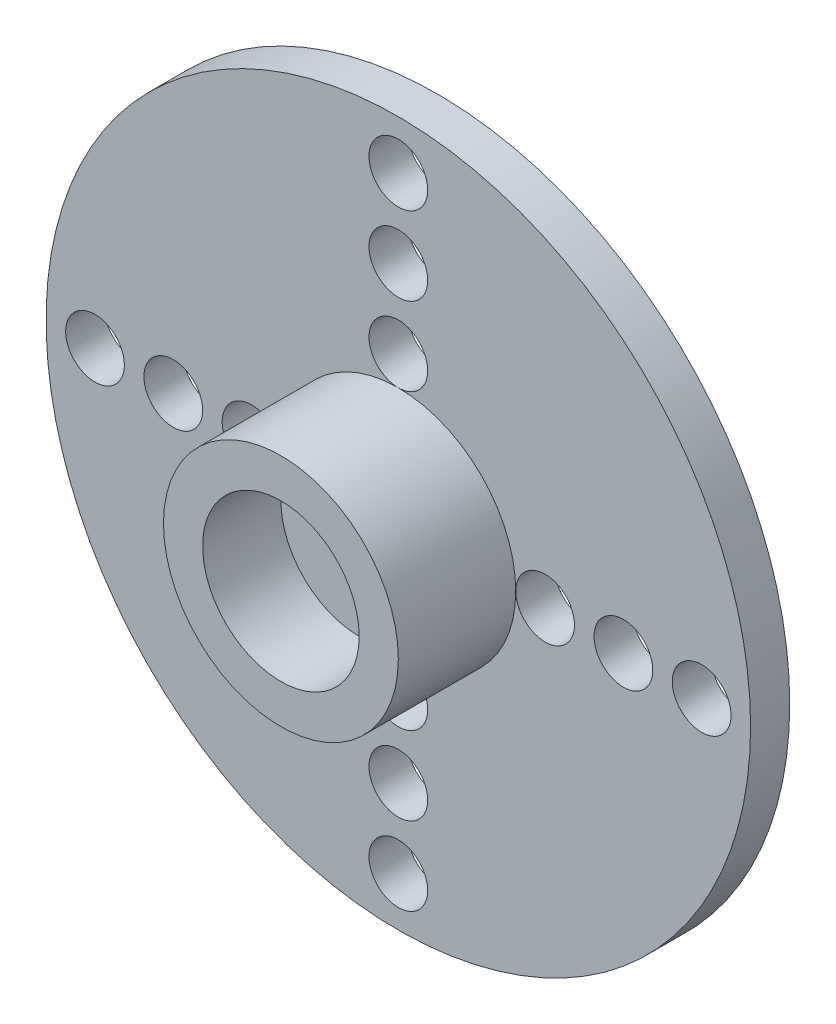
ISO-10303-21;
HEADER;
FILE_DESCRIPTION(('STEP AP214'),'2;1');
FILE_NAME('part.step','',(''),(''),'','','');
FILE_SCHEMA(('AUTOMOTIVE_DESIGN { 1 0 10303 214 1 1 1 1 }'));
ENDSEC;
DATA;
#1=APPLICATION_CONTEXT('core data for automotive mechanical design processes');
#2=APPLICATION_PROTOCOL_DEFINITION('international standard','automotive_design',2000,#1);
#3=PRODUCT_CONTEXT('',#1,'mechanical');
#4=PRODUCT('Part','Part','',(#3));
#5=PRODUCT_RELATED_PRODUCT_CATEGORY('part','',(#4));
#6=PRODUCT_DEFINITION_FORMATION('','',#4);
#7=PRODUCT_DEFINITION_CONTEXT('part definition',#1,'design');
#8=PRODUCT_DEFINITION('design','',#6,#7);
#9=PRODUCT_DEFINITION_SHAPE('','',#8);
#10=(LENGTH_UNIT() NAMED_UNIT(*) SI_UNIT(.MILLI.,.METRE.));
#11=(NAMED_UNIT(*) PLANE_ANGLE_UNIT() SI_UNIT($,.RADIAN.));
#12=(NAMED_UNIT(*) SI_UNIT($,.STERADIAN.) SOLID_ANGLE_UNIT());
#13=UNCERTAINTY_MEASURE_WITH_UNIT(LENGTH_MEASURE(1.E-05),#10,'distance_accuracy_value','');
#14=(GEOMETRIC_REPRESENTATION_CONTEXT(3) GLOBAL_UNCERTAINTY_ASSIGNED_CONTEXT((#13)) GLOBAL_UNIT_ASSIGNED_CONTEXT((#10,
#11,#12)) REPRESENTATION_CONTEXT('',''));
#15=CARTESIAN_POINT('',(0.,0.,0.));
#16=DIRECTION('',(0.,0.,1.));
#17=DIRECTION('',(1.,0.,0.));
#18=AXIS2_PLACEMENT_3D('',#15,#16,#17);
#19=CARTESIAN_POINT('',(0.,0.,1.));
#20=DIRECTION('',(0.,0.,-1.));
#21=DIRECTION('',(-1.,0.,0.));
#22=AXIS2_PLACEMENT_3D('',#19,#20,#21);
#23=CYLINDRICAL_SURFACE('',#22,9.);
#24=CARTESIAN_POINT('',(0.,0.,1.));
#25=DIRECTION('',(0.,0.,1.));
#26=DIRECTION('',(1.,0.,0.));
#27=AXIS2_PLACEMENT_3D('',#24,#25,#26);
#28=CIRCLE('',#27,9.);
#29=CARTESIAN_POINT('',(9.,0.,1.));
#30=VERTEX_POINT('',#29);
#31=EDGE_CURVE('E44',#30,#30,#28,.T.);
#32=ORIENTED_EDGE('',*,*,#31,.F.);
#33=EDGE_LOOP('',(#32));
#34=FACE_BOUND('',#33,.T.);
#35=CARTESIAN_POINT('',(0.,0.,0.));
#36=DIRECTION('',(0.,0.,1.));
#37=DIRECTION('',(1.,0.,0.));
#38=AXIS2_PLACEMENT_3D('',#35,#36,#37);
#39=CIRCLE('',#38,9.);
#40=CARTESIAN_POINT('',(9.,0.,0.));
#41=VERTEX_POINT('',#40);
#42=EDGE_CURVE('E90',#41,#41,#39,.T.);
#43=ORIENTED_EDGE('',*,*,#42,.T.);
#44=EDGE_LOOP('',(#43));
#45=FACE_BOUND('',#44,.T.);
#46=ADVANCED_FACE('F37',(#34,#45),#23,.T.);
#47=CARTESIAN_POINT('',(0.,0.,1.));
#48=DIRECTION('',(0.,0.,1.));
#49=DIRECTION('',(1.,0.,0.));
#50=AXIS2_PLACEMENT_3D('',#47,#48,#49);
#51=PLANE('',#50);
#52=CARTESIAN_POINT('',(0.,-7.75,1.));
#53=DIRECTION('',(0.,0.,1.));
#54=DIRECTION('',(-1.,0.,0.));
#55=AXIS2_PLACEMENT_3D('',#52,#53,#54);
#56=CIRCLE('',#55,0.75);
#57=CARTESIAN_POINT('',(-0.75,-7.75,1.));
#58=VERTEX_POINT('',#57);
#59=EDGE_CURVE('E139',#58,#58,#56,.T.);
#60=ORIENTED_EDGE('',*,*,#59,.F.);
#61=EDGE_LOOP('',(#60));
#62=FACE_BOUND('',#61,.T.);
#63=CARTESIAN_POINT('',(0.,-5.75,1.));
#64=DIRECTION('',(0.,0.,1.));
#65=DIRECTION('',(-1.,0.,0.));
#66=AXIS2_PLACEMENT_3D('',#63,#64,#65);
#67=CIRCLE('',#66,0.75);
#68=CARTESIAN_POINT('',(-0.75,-5.75,1.));
#69=VERTEX_POINT('',#68);
#70=EDGE_CURVE('E134',#69,#69,#67,.T.);
#71=ORIENTED_EDGE('',*,*,#70,.F.);
#72=EDGE_LOOP('',(#71));
#73=FACE_BOUND('',#72,.T.);
#74=CARTESIAN_POINT('',(5.75,0.,1.));
#75=DIRECTION('',(0.,0.,1.));
#76=DIRECTION('',(1.,0.,0.));
#77=AXIS2_PLACEMENT_3D('',#74,#75,#76);
#78=CIRCLE('',#77,0.75);
#79=CARTESIAN_POINT('',(6.5,0.,1.));
#80=VERTEX_POINT('',#79);
#81=EDGE_CURVE('E75',#80,#80,#78,.T.);
#82=ORIENTED_EDGE('',*,*,#81,.F.);
#83=EDGE_LOOP('',(#82));
#84=FACE_BOUND('',#83,.T.);
#85=CARTESIAN_POINT('',(7.75,0.,1.));
#86=DIRECTION('',(0.,0.,1.));
#87=DIRECTION('',(1.,0.,0.));
#88=AXIS2_PLACEMENT_3D('',#85,#86,#87);
#89=CIRCLE('',#88,0.75);
#90=CARTESIAN_POINT('',(8.5,0.,1.));
#91=VERTEX_POINT('',#90);
#92=EDGE_CURVE('E116',#91,#91,#89,.T.);
#93=ORIENTED_EDGE('',*,*,#92,.F.);
#94=EDGE_LOOP('',(#93));
#95=FACE_BOUND('',#94,.T.);
#96=CARTESIAN_POINT('',(-5.75,0.,1.));
#97=DIRECTION('',(0.,0.,1.));
#98=DIRECTION('',(-1.,0.,0.));
#99=AXIS2_PLACEMENT_3D('',#96,#97,#98);
#100=CIRCLE('',#99,0.75);
#101=CARTESIAN_POINT('',(-6.5,0.,1.));
#102=VERTEX_POINT('',#101);
#103=EDGE_CURVE('E119',#102,#102,#100,.T.);
#104=ORIENTED_EDGE('',*,*,#103,.F.);
#105=EDGE_LOOP('',(#104));
#106=FACE_BOUND('',#105,.T.);
#107=CARTESIAN_POINT('',(-7.75,0.,1.));
#108=DIRECTION('',(0.,0.,1.));
#109=DIRECTION('',(-1.,0.,0.));
#110=AXIS2_PLACEMENT_3D('',#107,#108,#109);
#111=CIRCLE('',#110,0.75);
#112=CARTESIAN_POINT('',(-8.5,0.,1.));
#113=VERTEX_POINT('',#112);
#114=EDGE_CURVE('E162',#113,#113,#111,.T.);
#115=ORIENTED_EDGE('',*,*,#114,.F.);
#116=EDGE_LOOP('',(#115));
#117=FACE_BOUND('',#116,.T.);
#118=CARTESIAN_POINT('',(0.,5.75,1.));
#119=DIRECTION('',(0.,0.,1.));
#120=DIRECTION('',(1.,0.,0.));
#121=AXIS2_PLACEMENT_3D('',#118,#119,#120);
#122=CIRCLE('',#121,0.75);
#123=CARTESIAN_POINT('',(0.75,5.75,1.));
#124=VERTEX_POINT('',#123);
#125=EDGE_CURVE('E166',#124,#124,#122,.T.);
#126=ORIENTED_EDGE('',*,*,#125,.F.);
#127=EDGE_LOOP('',(#126));
#128=FACE_BOUND('',#127,.T.);
#129=CARTESIAN_POINT('',(0.,7.75,1.));
#130=DIRECTION('',(0.,0.,1.));
#131=DIRECTION('',(1.,0.,0.));
#132=AXIS2_PLACEMENT_3D('',#129,#130,#131);
#133=CIRCLE('',#132,0.75);
#134=CARTESIAN_POINT('',(0.75,7.75,1.));
#135=VERTEX_POINT('',#134);
#136=EDGE_CURVE('E129',#135,#135,#133,.T.);
#137=ORIENTED_EDGE('',*,*,#136,.F.);
#138=EDGE_LOOP('',(#137));
#139=FACE_BOUND('',#138,.T.);
#140=CARTESIAN_POINT('',(0.,0.,1.));
#141=DIRECTION('',(0.,0.,1.));
#142=DIRECTION('',(1.,0.,0.));
#143=AXIS2_PLACEMENT_3D('',#140,#141,#142);
#144=CIRCLE('',#143,3.);
#145=CARTESIAN_POINT('',(0.,-3.,1.));
#146=VERTEX_POINT('',#145);
#147=CARTESIAN_POINT('',(3.,0.,1.));
#148=VERTEX_POINT('',#147);
#149=EDGE_CURVE('E95',#146,#148,#144,.T.);
#150=ORIENTED_EDGE('',*,*,#149,.F.);
#151=CARTESIAN_POINT('',(0.,-3.75,1.));
#152=DIRECTION('',(0.,0.,1.));
#153=DIRECTION('',(-1.,0.,0.));
#154=AXIS2_PLACEMENT_3D('',#151,#152,#153);
#155=CIRCLE('',#154,0.75);
#156=EDGE_CURVE('E49',#146,#146,#155,.T.);
#157=ORIENTED_EDGE('',*,*,#156,.F.);
#158=CARTESIAN_POINT('',(-3.,0.,1.));
#159=VERTEX_POINT('',#158);
#160=EDGE_CURVE('E100',#159,#146,#144,.T.);
#161=ORIENTED_EDGE('',*,*,#160,.F.);
#162=CARTESIAN_POINT('',(-3.75,0.,1.));
#163=DIRECTION('',(0.,0.,1.));
#164=DIRECTION('',(-1.,0.,0.));
#165=AXIS2_PLACEMENT_3D('',#162,#163,#164);
#166=CIRCLE('',#165,0.75);
#167=EDGE_CURVE('E54',#159,#159,#166,.T.);
#168=ORIENTED_EDGE('',*,*,#167,.F.);
#169=CARTESIAN_POINT('',(0.,3.,1.));
#170=VERTEX_POINT('',#169);
#171=EDGE_CURVE('E94',#170,#159,#144,.T.);
#172=ORIENTED_EDGE('',*,*,#171,.F.);
#173=CARTESIAN_POINT('',(0.,3.75,1.));
#174=DIRECTION('',(0.,0.,1.));
#175=DIRECTION('',(1.,0.,0.));
#176=AXIS2_PLACEMENT_3D('',#173,#174,#175);
#177=CIRCLE('',#176,0.75);
#178=EDGE_CURVE('E111',#170,#170,#177,.T.);
#179=ORIENTED_EDGE('',*,*,#178,.F.);
#180=EDGE_CURVE('E91',#148,#170,#144,.T.);
#181=ORIENTED_EDGE('',*,*,#180,.F.);
#182=CARTESIAN_POINT('',(3.75,0.,1.));
#183=DIRECTION('',(0.,0.,1.));
#184=DIRECTION('',(1.,0.,0.));
#185=AXIS2_PLACEMENT_3D('',#182,#183,#184);
#186=CIRCLE('',#185,0.75);
#187=EDGE_CURVE('E62',#148,#148,#186,.T.);
#188=ORIENTED_EDGE('',*,*,#187,.F.);
#189=EDGE_LOOP('',(#150,#157,#161,#168,#172,#179,#181,#188));
#190=FACE_BOUND('',#189,.T.);
#191=ORIENTED_EDGE('',*,*,#31,.T.);
#192=EDGE_LOOP('',(#191));
#193=FACE_BOUND('',#192,.T.);
#194=ADVANCED_FACE('F109',(#62,#73,#84,#95,#106,#117,#128,#139,#190,#193),#51,.T.);
#195=CARTESIAN_POINT('',(0.,0.,0.));
#196=DIRECTION('',(0.,0.,1.));
#197=DIRECTION('',(1.,0.,0.));
#198=AXIS2_PLACEMENT_3D('',#195,#196,#197);
#199=PLANE('',#198);
#200=CARTESIAN_POINT('',(0.,-7.75,0.));
#201=DIRECTION('',(0.,0.,1.));
#202=DIRECTION('',(-1.,0.,0.));
#203=AXIS2_PLACEMENT_3D('',#200,#201,#202);
#204=CIRCLE('',#203,0.75);
#205=CARTESIAN_POINT('',(-0.75,-7.75,0.));
#206=VERTEX_POINT('',#205);
#207=EDGE_CURVE('E137',#206,#206,#204,.T.);
#208=ORIENTED_EDGE('',*,*,#207,.T.);
#209=EDGE_LOOP('',(#208));
#210=FACE_BOUND('',#209,.T.);
#211=CARTESIAN_POINT('',(0.,-5.75,0.));
#212=DIRECTION('',(0.,0.,1.));
#213=DIRECTION('',(-1.,0.,0.));
#214=AXIS2_PLACEMENT_3D('',#211,#212,#213);
#215=CIRCLE('',#214,0.75);
#216=CARTESIAN_POINT('',(-0.75,-5.75,0.));
#217=VERTEX_POINT('',#216);
#218=EDGE_CURVE('E131',#217,#217,#215,.T.);
#219=ORIENTED_EDGE('',*,*,#218,.T.);
#220=EDGE_LOOP('',(#219));
#221=FACE_BOUND('',#220,.T.);
#222=CARTESIAN_POINT('',(0.,-3.75,0.));
#223=DIRECTION('',(0.,0.,1.));
#224=DIRECTION('',(-1.,0.,0.));
#225=AXIS2_PLACEMENT_3D('',#222,#223,#224);
#226=CIRCLE('',#225,0.75);
#227=CARTESIAN_POINT('',(-0.75,-3.75,0.));
#228=VERTEX_POINT('',#227);
#229=EDGE_CURVE('E126',#228,#228,#226,.T.);
#230=ORIENTED_EDGE('',*,*,#229,.T.);
#231=EDGE_LOOP('',(#230));
#232=FACE_BOUND('',#231,.T.);
#233=CARTESIAN_POINT('',(5.75,0.,0.));
#234=DIRECTION('',(0.,0.,1.));
#235=DIRECTION('',(1.,0.,0.));
#236=AXIS2_PLACEMENT_3D('',#233,#234,#235);
#237=CIRCLE('',#236,0.75);
#238=CARTESIAN_POINT('',(6.5,0.,0.));
#239=VERTEX_POINT('',#238);
#240=EDGE_CURVE('E69',#239,#239,#237,.T.);
#241=ORIENTED_EDGE('',*,*,#240,.T.);
#242=EDGE_LOOP('',(#241));
#243=FACE_BOUND('',#242,.T.);
#244=CARTESIAN_POINT('',(7.75,0.,0.));
#245=DIRECTION('',(0.,0.,1.));
#246=DIRECTION('',(1.,0.,0.));
#247=AXIS2_PLACEMENT_3D('',#244,#245,#246);
#248=CIRCLE('',#247,0.75);
#249=CARTESIAN_POINT('',(8.5,0.,0.));
#250=VERTEX_POINT('',#249);
#251=EDGE_CURVE('E177',#250,#250,#248,.T.);
#252=ORIENTED_EDGE('',*,*,#251,.T.);
#253=EDGE_LOOP('',(#252));
#254=FACE_BOUND('',#253,.T.);
#255=CARTESIAN_POINT('',(-3.75,0.,0.));
#256=DIRECTION('',(0.,0.,1.));
#257=DIRECTION('',(-1.,0.,0.));
#258=AXIS2_PLACEMENT_3D('',#255,#256,#257);
#259=CIRCLE('',#258,0.75);
#260=CARTESIAN_POINT('',(-4.5,0.,0.));
#261=VERTEX_POINT('',#260);
#262=EDGE_CURVE('E112',#261,#261,#259,.T.);
#263=ORIENTED_EDGE('',*,*,#262,.T.);
#264=EDGE_LOOP('',(#263));
#265=FACE_BOUND('',#264,.T.);
#266=CARTESIAN_POINT('',(-5.75,0.,0.));
#267=DIRECTION('',(0.,0.,1.));
#268=DIRECTION('',(-1.,0.,0.));
#269=AXIS2_PLACEMENT_3D('',#266,#267,#268);
#270=CIRCLE('',#269,0.75);
#271=CARTESIAN_POINT('',(-6.5,0.,0.));
#272=VERTEX_POINT('',#271);
#273=EDGE_CURVE('E113',#272,#272,#270,.T.);
#274=ORIENTED_EDGE('',*,*,#273,.T.);
#275=EDGE_LOOP('',(#274));
#276=FACE_BOUND('',#275,.T.);
#277=CARTESIAN_POINT('',(-7.75,0.,0.));
#278=DIRECTION('',(0.,0.,1.));
#279=DIRECTION('',(-1.,0.,0.));
#280=AXIS2_PLACEMENT_3D('',#277,#278,#279);
#281=CIRCLE('',#280,0.75);
#282=CARTESIAN_POINT('',(-8.5,0.,0.));
#283=VERTEX_POINT('',#282);
#284=EDGE_CURVE('E125',#283,#283,#281,.T.);
#285=ORIENTED_EDGE('',*,*,#284,.T.);
#286=EDGE_LOOP('',(#285));
#287=FACE_BOUND('',#286,.T.);
#288=CARTESIAN_POINT('',(0.,3.75,0.));
#289=DIRECTION('',(0.,0.,1.));
#290=DIRECTION('',(1.,0.,0.));
#291=AXIS2_PLACEMENT_3D('',#288,#289,#290);
#292=CIRCLE('',#291,0.75);
#293=CARTESIAN_POINT('',(0.75,3.75,0.));
#294=VERTEX_POINT('',#293);
#295=EDGE_CURVE('E361',#294,#294,#292,.T.);
#296=ORIENTED_EDGE('',*,*,#295,.T.);
#297=EDGE_LOOP('',(#296));
#298=FACE_BOUND('',#297,.T.);
#299=CARTESIAN_POINT('',(0.,5.75,0.));
#300=DIRECTION('',(0.,0.,1.));
#301=DIRECTION('',(1.,0.,0.));
#302=AXIS2_PLACEMENT_3D('',#299,#300,#301);
#303=CIRCLE('',#302,0.75);
#304=CARTESIAN_POINT('',(0.75,5.75,0.));
#305=VERTEX_POINT('',#304);
#306=EDGE_CURVE('E365',#305,#305,#303,.T.);
#307=ORIENTED_EDGE('',*,*,#306,.T.);
#308=EDGE_LOOP('',(#307));
#309=FACE_BOUND('',#308,.T.);
#310=CARTESIAN_POINT('',(0.,7.75,0.));
#311=DIRECTION('',(0.,0.,1.));
#312=DIRECTION('',(1.,0.,0.));
#313=AXIS2_PLACEMENT_3D('',#310,#311,#312);
#314=CIRCLE('',#313,0.75);
#315=CARTESIAN_POINT('',(0.75,7.75,0.));
#316=VERTEX_POINT('',#315);
#317=EDGE_CURVE('E170',#316,#316,#314,.T.);
#318=ORIENTED_EDGE('',*,*,#317,.T.);
#319=EDGE_LOOP('',(#318));
#320=FACE_BOUND('',#319,.T.);
#321=CARTESIAN_POINT('',(3.75,0.,0.));
#322=DIRECTION('',(0.,0.,1.));
#323=DIRECTION('',(1.,0.,0.));
#324=AXIS2_PLACEMENT_3D('',#321,#322,#323);
#325=CIRCLE('',#324,0.75);
#326=CARTESIAN_POINT('',(4.5,0.,0.));
#327=VERTEX_POINT('',#326);
#328=EDGE_CURVE('E68',#327,#327,#325,.T.);
#329=ORIENTED_EDGE('',*,*,#328,.T.);
#330=EDGE_LOOP('',(#329));
#331=FACE_BOUND('',#330,.T.);
#332=CARTESIAN_POINT('',(0.,0.,0.));
#333=DIRECTION('',(0.,0.,1.));
#334=DIRECTION('',(1.,0.,0.));
#335=AXIS2_PLACEMENT_3D('',#332,#333,#334);
#336=CIRCLE('',#335,0.75);
#337=CARTESIAN_POINT('',(0.75,0.,0.));
#338=VERTEX_POINT('',#337);
#339=EDGE_CURVE('E79',#338,#338,#336,.T.);
#340=ORIENTED_EDGE('',*,*,#339,.T.);
#341=EDGE_LOOP('',(#340));
#342=FACE_BOUND('',#341,.T.);
#343=ORIENTED_EDGE('',*,*,#42,.F.);
#344=EDGE_LOOP('',(#343));
#345=FACE_BOUND('',#344,.T.);
#346=ADVANCED_FACE('F147',(#210,#221,#232,#243,#254,#265,#276,#287,#298,#309,#320,#331,#342,
#345),#199,.F.);
#347=CARTESIAN_POINT('',(0.,0.,4.));
#348=DIRECTION('',(0.,0.,-1.));
#349=DIRECTION('',(-1.,0.,0.));
#350=AXIS2_PLACEMENT_3D('',#347,#348,#349);
#351=CYLINDRICAL_SURFACE('',#350,2.);
#352=CARTESIAN_POINT('',(0.,0.,2.));
#353=DIRECTION('',(0.,0.,1.));
#354=DIRECTION('',(1.,0.,0.));
#355=AXIS2_PLACEMENT_3D('',#352,#353,#354);
#356=CIRCLE('',#355,2.);
#357=CARTESIAN_POINT('',(2.,0.,2.));
#358=VERTEX_POINT('',#357);
#359=EDGE_CURVE('E11',#358,#358,#356,.T.);
#360=ORIENTED_EDGE('',*,*,#359,.F.);
#361=EDGE_LOOP('',(#360));
#362=FACE_BOUND('',#361,.T.);
#363=CARTESIAN_POINT('',(0.,0.,4.));
#364=DIRECTION('',(0.,0.,1.));
#365=DIRECTION('',(1.,0.,0.));
#366=AXIS2_PLACEMENT_3D('',#363,#364,#365);
#367=CIRCLE('',#366,2.);
#368=CARTESIAN_POINT('',(2.,0.,4.));
#369=VERTEX_POINT('',#368);
#370=EDGE_CURVE('E82',#369,#369,#367,.T.);
#371=ORIENTED_EDGE('',*,*,#370,.T.);
#372=EDGE_LOOP('',(#371));
#373=FACE_BOUND('',#372,.T.);
#374=ADVANCED_FACE('F214',(#362,#373),#351,.F.);
#375=CARTESIAN_POINT('',(0.,0.,4.));
#376=DIRECTION('',(0.,0.,-1.));
#377=DIRECTION('',(-1.,0.,0.));
#378=AXIS2_PLACEMENT_3D('',#375,#376,#377);
#379=CYLINDRICAL_SURFACE('',#378,3.);
#380=ORIENTED_EDGE('',*,*,#180,.T.);
#381=ORIENTED_EDGE('',*,*,#171,.T.);
#382=ORIENTED_EDGE('',*,*,#160,.T.);
#383=ORIENTED_EDGE('',*,*,#149,.T.);
#384=EDGE_LOOP('',(#380,#381,#382,#383));
#385=FACE_BOUND('',#384,.T.);
#386=CARTESIAN_POINT('',(0.,0.,4.));
#387=DIRECTION('',(0.,0.,1.));
#388=DIRECTION('',(1.,0.,0.));
#389=AXIS2_PLACEMENT_3D('',#386,#387,#388);
#390=CIRCLE('',#389,3.);
#391=CARTESIAN_POINT('',(3.,0.,4.));
#392=VERTEX_POINT('',#391);
#393=EDGE_CURVE('E87',#392,#392,#390,.T.);
#394=ORIENTED_EDGE('',*,*,#393,.F.);
#395=EDGE_LOOP('',(#394));
#396=FACE_BOUND('',#395,.T.);
#397=ADVANCED_FACE('F106',(#385,#396),#379,.T.);
#398=CARTESIAN_POINT('',(0.,0.,4.));
#399=DIRECTION('',(0.,0.,1.));
#400=DIRECTION('',(1.,0.,0.));
#401=AXIS2_PLACEMENT_3D('',#398,#399,#400);
#402=PLANE('',#401);
#403=ORIENTED_EDGE('',*,*,#370,.F.);
#404=EDGE_LOOP('',(#403));
#405=FACE_BOUND('',#404,.T.);
#406=ORIENTED_EDGE('',*,*,#393,.T.);
#407=EDGE_LOOP('',(#406));
#408=FACE_BOUND('',#407,.T.);
#409=ADVANCED_FACE('F229',(#405,#408),#402,.T.);
#410=CARTESIAN_POINT('',(0.,0.,2.));
#411=DIRECTION('',(0.,0.,1.));
#412=DIRECTION('',(1.,0.,0.));
#413=AXIS2_PLACEMENT_3D('',#410,#411,#412);
#414=PLANE('',#413);
#415=CARTESIAN_POINT('',(0.,0.,2.));
#416=DIRECTION('',(0.,0.,1.));
#417=DIRECTION('',(1.,0.,0.));
#418=AXIS2_PLACEMENT_3D('',#415,#416,#417);
#419=CIRCLE('',#418,0.75);
#420=CARTESIAN_POINT('',(0.75,0.,2.));
#421=VERTEX_POINT('',#420);
#422=EDGE_CURVE('E72',#421,#421,#419,.T.);
#423=ORIENTED_EDGE('',*,*,#422,.F.);
#424=EDGE_LOOP('',(#423));
#425=FACE_BOUND('',#424,.T.);
#426=ORIENTED_EDGE('',*,*,#359,.T.);
#427=EDGE_LOOP('',(#426));
#428=FACE_BOUND('',#427,.T.);
#429=ADVANCED_FACE('F236',(#425,#428),#414,.T.);
#430=CARTESIAN_POINT('',(0.,0.,0.));
#431=DIRECTION('',(0.,0.,1.));
#432=DIRECTION('',(1.,0.,0.));
#433=AXIS2_PLACEMENT_3D('',#430,#431,#432);
#434=CYLINDRICAL_SURFACE('',#433,0.75);
#435=ORIENTED_EDGE('',*,*,#339,.F.);
#436=EDGE_LOOP('',(#435));
#437=FACE_BOUND('',#436,.T.);
#438=ORIENTED_EDGE('',*,*,#422,.T.);
#439=EDGE_LOOP('',(#438));
#440=FACE_BOUND('',#439,.T.);
#441=ADVANCED_FACE('F243',(#437,#440),#434,.F.);
#442=CARTESIAN_POINT('',(3.75,0.,0.));
#443=DIRECTION('',(0.,0.,1.));
#444=DIRECTION('',(1.,0.,0.));
#445=AXIS2_PLACEMENT_3D('',#442,#443,#444);
#446=CYLINDRICAL_SURFACE('',#445,0.75);
#447=ORIENTED_EDGE('',*,*,#328,.F.);
#448=EDGE_LOOP('',(#447));
#449=FACE_BOUND('',#448,.T.);
#450=ORIENTED_EDGE('',*,*,#187,.T.);
#451=EDGE_LOOP('',(#450));
#452=FACE_BOUND('',#451,.T.);
#453=ADVANCED_FACE('F63',(#449,#452),#446,.F.);
#454=CARTESIAN_POINT('',(0.,7.75,0.));
#455=DIRECTION('',(0.,0.,1.));
#456=DIRECTION('',(1.,0.,0.));
#457=AXIS2_PLACEMENT_3D('',#454,#455,#456);
#458=CYLINDRICAL_SURFACE('',#457,0.75);
#459=ORIENTED_EDGE('',*,*,#317,.F.);
#460=EDGE_LOOP('',(#459));
#461=FACE_BOUND('',#460,.T.);
#462=ORIENTED_EDGE('',*,*,#136,.T.);
#463=EDGE_LOOP('',(#462));
#464=FACE_BOUND('',#463,.T.);
#465=ADVANCED_FACE('F256',(#461,#464),#458,.F.);
#466=CARTESIAN_POINT('',(0.,5.75,0.));
#467=DIRECTION('',(0.,0.,1.));
#468=DIRECTION('',(1.,0.,0.));
#469=AXIS2_PLACEMENT_3D('',#466,#467,#468);
#470=CYLINDRICAL_SURFACE('',#469,0.75);
#471=ORIENTED_EDGE('',*,*,#306,.F.);
#472=EDGE_LOOP('',(#471));
#473=FACE_BOUND('',#472,.T.);
#474=ORIENTED_EDGE('',*,*,#125,.T.);
#475=EDGE_LOOP('',(#474));
#476=FACE_BOUND('',#475,.T.);
#477=ADVANCED_FACE('F264',(#473,#476),#470,.F.);
#478=CARTESIAN_POINT('',(0.,3.75,0.));
#479=DIRECTION('',(0.,0.,1.));
#480=DIRECTION('',(1.,0.,0.));
#481=AXIS2_PLACEMENT_3D('',#478,#479,#480);
#482=CYLINDRICAL_SURFACE('',#481,0.75);
#483=ORIENTED_EDGE('',*,*,#295,.F.);
#484=EDGE_LOOP('',(#483));
#485=FACE_BOUND('',#484,.T.);
#486=ORIENTED_EDGE('',*,*,#178,.T.);
#487=EDGE_LOOP('',(#486));
#488=FACE_BOUND('',#487,.T.);
#489=ADVANCED_FACE('F272',(#485,#488),#482,.F.);
#490=CARTESIAN_POINT('',(-7.75,0.,0.));
#491=DIRECTION('',(0.,0.,1.));
#492=DIRECTION('',(1.,0.,0.));
#493=AXIS2_PLACEMENT_3D('',#490,#491,#492);
#494=CYLINDRICAL_SURFACE('',#493,0.75);
#495=ORIENTED_EDGE('',*,*,#284,.F.);
#496=EDGE_LOOP('',(#495));
#497=FACE_BOUND('',#496,.T.);
#498=ORIENTED_EDGE('',*,*,#114,.T.);
#499=EDGE_LOOP('',(#498));
#500=FACE_BOUND('',#499,.T.);
#501=ADVANCED_FACE('F280',(#497,#500),#494,.F.);
#502=CARTESIAN_POINT('',(-5.75,0.,0.));
#503=DIRECTION('',(0.,0.,1.));
#504=DIRECTION('',(1.,0.,0.));
#505=AXIS2_PLACEMENT_3D('',#502,#503,#504);
#506=CYLINDRICAL_SURFACE('',#505,0.75);
#507=ORIENTED_EDGE('',*,*,#273,.F.);
#508=EDGE_LOOP('',(#507));
#509=FACE_BOUND('',#508,.T.);
#510=ORIENTED_EDGE('',*,*,#103,.T.);
#511=EDGE_LOOP('',(#510));
#512=FACE_BOUND('',#511,.T.);
#513=ADVANCED_FACE('F193',(#509,#512),#506,.F.);
#514=CARTESIAN_POINT('',(-3.75,0.,0.));
#515=DIRECTION('',(0.,0.,1.));
#516=DIRECTION('',(1.,0.,0.));
#517=AXIS2_PLACEMENT_3D('',#514,#515,#516);
#518=CYLINDRICAL_SURFACE('',#517,0.75);
#519=ORIENTED_EDGE('',*,*,#262,.F.);
#520=EDGE_LOOP('',(#519));
#521=FACE_BOUND('',#520,.T.);
#522=ORIENTED_EDGE('',*,*,#167,.T.);
#523=EDGE_LOOP('',(#522));
#524=FACE_BOUND('',#523,.T.);
#525=ADVANCED_FACE('F183',(#521,#524),#518,.F.);
#526=CARTESIAN_POINT('',(7.75,0.,0.));
#527=DIRECTION('',(0.,0.,1.));
#528=DIRECTION('',(1.,0.,0.));
#529=AXIS2_PLACEMENT_3D('',#526,#527,#528);
#530=CYLINDRICAL_SURFACE('',#529,0.75);
#531=ORIENTED_EDGE('',*,*,#251,.F.);
#532=EDGE_LOOP('',(#531));
#533=FACE_BOUND('',#532,.T.);
#534=ORIENTED_EDGE('',*,*,#92,.T.);
#535=EDGE_LOOP('',(#534));
#536=FACE_BOUND('',#535,.T.);
#537=ADVANCED_FACE('F180',(#533,#536),#530,.F.);
#538=CARTESIAN_POINT('',(5.75,0.,0.));
#539=DIRECTION('',(0.,0.,1.));
#540=DIRECTION('',(1.,0.,0.));
#541=AXIS2_PLACEMENT_3D('',#538,#539,#540);
#542=CYLINDRICAL_SURFACE('',#541,0.75);
#543=ORIENTED_EDGE('',*,*,#240,.F.);
#544=EDGE_LOOP('',(#543));
#545=FACE_BOUND('',#544,.T.);
#546=ORIENTED_EDGE('',*,*,#81,.T.);
#547=EDGE_LOOP('',(#546));
#548=FACE_BOUND('',#547,.T.);
#549=ADVANCED_FACE('F182',(#545,#548),#542,.F.);
#550=CARTESIAN_POINT('',(0.,-3.75,0.));
#551=DIRECTION('',(0.,0.,1.));
#552=DIRECTION('',(1.,0.,0.));
#553=AXIS2_PLACEMENT_3D('',#550,#551,#552);
#554=CYLINDRICAL_SURFACE('',#553,0.75);
#555=ORIENTED_EDGE('',*,*,#229,.F.);
#556=EDGE_LOOP('',(#555));
#557=FACE_BOUND('',#556,.T.);
#558=ORIENTED_EDGE('',*,*,#156,.T.);
#559=EDGE_LOOP('',(#558));
#560=FACE_BOUND('',#559,.T.);
#561=ADVANCED_FACE('F190',(#557,#560),#554,.F.);
#562=CARTESIAN_POINT('',(0.,-5.75,0.));
#563=DIRECTION('',(0.,0.,1.));
#564=DIRECTION('',(1.,0.,0.));
#565=AXIS2_PLACEMENT_3D('',#562,#563,#564);
#566=CYLINDRICAL_SURFACE('',#565,0.75);
#567=ORIENTED_EDGE('',*,*,#218,.F.);
#568=EDGE_LOOP('',(#567));
#569=FACE_BOUND('',#568,.T.);
#570=ORIENTED_EDGE('',*,*,#70,.T.);
#571=EDGE_LOOP('',(#570));
#572=FACE_BOUND('',#571,.T.);
#573=ADVANCED_FACE('F319',(#569,#572),#566,.F.);
#574=CARTESIAN_POINT('',(0.,-7.75,0.));
#575=DIRECTION('',(0.,0.,1.));
#576=DIRECTION('',(1.,0.,0.));
#577=AXIS2_PLACEMENT_3D('',#574,#575,#576);
#578=CYLINDRICAL_SURFACE('',#577,0.75);
#579=ORIENTED_EDGE('',*,*,#207,.F.);
#580=EDGE_LOOP('',(#579));
#581=FACE_BOUND('',#580,.T.);
#582=ORIENTED_EDGE('',*,*,#59,.T.);
#583=EDGE_LOOP('',(#582));
#584=FACE_BOUND('',#583,.T.);
#585=ADVANCED_FACE('F143',(#581,#584),#578,.F.);
#586=CLOSED_SHELL('',(#46,#194,#346,#374,#397,#409,#429,#441,#453,#465,#477,#489,#501,#513,#525,
#537,#549,#561,#573,#585));
#587=MANIFOLD_SOLID_BREP('B2',#586);
#588=ADVANCED_BREP_SHAPE_REPRESENTATION('',(#18,#587),#14);
#589=SHAPE_DEFINITION_REPRESENTATION(#9,#588);
ENDSEC;
END-ISO-10303-21;
